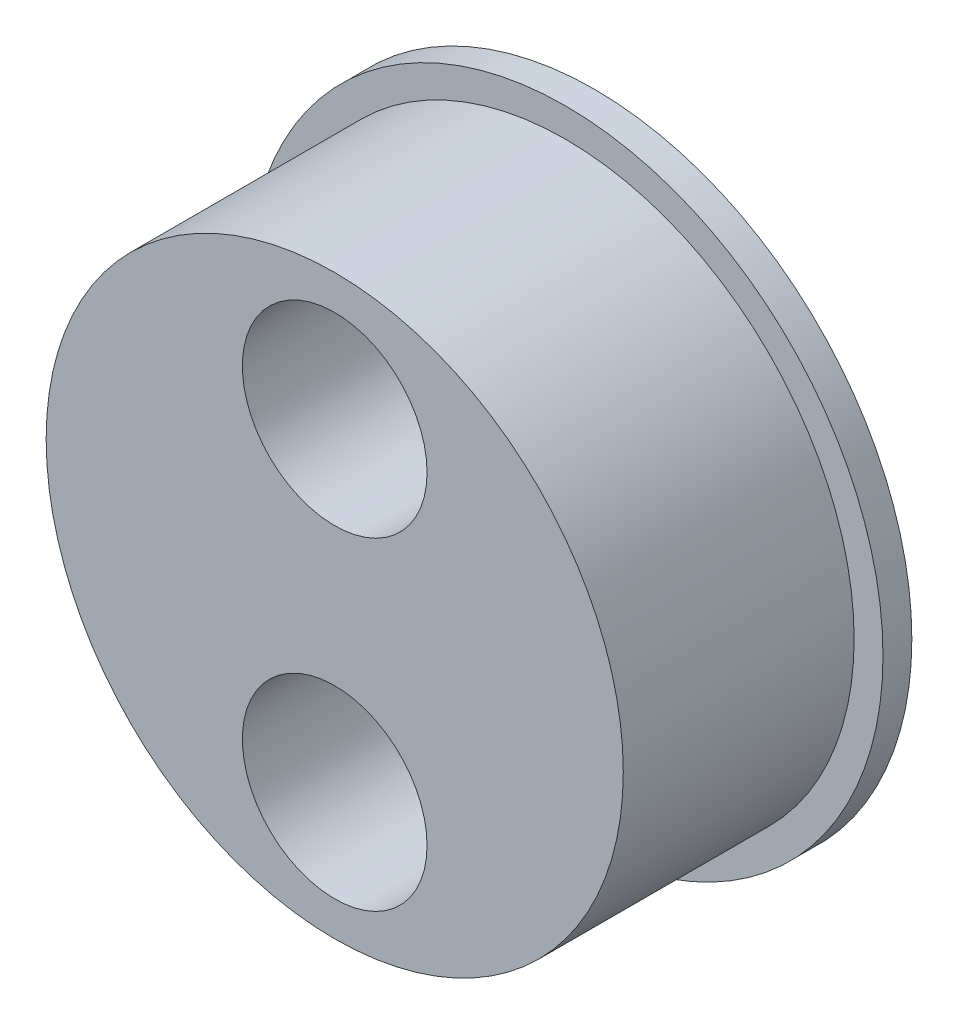
ISO-10303-21;
HEADER;
FILE_DESCRIPTION(('STEP AP214'),'2;1');
FILE_NAME('part.step','',(''),(''),'','','');
FILE_SCHEMA(('AUTOMOTIVE_DESIGN { 1 0 10303 214 1 1 1 1 }'));
ENDSEC;
DATA;
#1=APPLICATION_CONTEXT('core data for automotive mechanical design processes');
#2=APPLICATION_PROTOCOL_DEFINITION('international standard','automotive_design',2000,#1);
#3=PRODUCT_CONTEXT('',#1,'mechanical');
#4=PRODUCT('Part','Part','',(#3));
#5=PRODUCT_RELATED_PRODUCT_CATEGORY('part','',(#4));
#6=PRODUCT_DEFINITION_FORMATION('','',#4);
#7=PRODUCT_DEFINITION_CONTEXT('part definition',#1,'design');
#8=PRODUCT_DEFINITION('design','',#6,#7);
#9=PRODUCT_DEFINITION_SHAPE('','',#8);
#10=(LENGTH_UNIT() NAMED_UNIT(*) SI_UNIT(.MILLI.,.METRE.));
#11=(NAMED_UNIT(*) PLANE_ANGLE_UNIT() SI_UNIT($,.RADIAN.));
#12=(NAMED_UNIT(*) SI_UNIT($,.STERADIAN.) SOLID_ANGLE_UNIT());
#13=UNCERTAINTY_MEASURE_WITH_UNIT(LENGTH_MEASURE(1.E-05),#10,'distance_accuracy_value','');
#14=(GEOMETRIC_REPRESENTATION_CONTEXT(3) GLOBAL_UNCERTAINTY_ASSIGNED_CONTEXT((#13)) GLOBAL_UNIT_ASSIGNED_CONTEXT((#10,
#11,#12)) REPRESENTATION_CONTEXT('',''));
#15=CARTESIAN_POINT('',(0.,0.,0.));
#16=DIRECTION('',(0.,0.,1.));
#17=DIRECTION('',(1.,0.,0.));
#18=AXIS2_PLACEMENT_3D('',#15,#16,#17);
#19=CARTESIAN_POINT('',(0.,0.,19.));
#20=DIRECTION('',(0.,0.,-1.));
#21=DIRECTION('',(-1.,0.,0.));
#22=AXIS2_PLACEMENT_3D('',#19,#20,#21);
#23=CYLINDRICAL_SURFACE('',#22,5.);
#24=CARTESIAN_POINT('',(0.,0.,15.));
#25=DIRECTION('',(0.,0.,1.));
#26=DIRECTION('',(1.,0.,0.));
#27=AXIS2_PLACEMENT_3D('',#24,#25,#26);
#28=CIRCLE('',#27,5.);
#29=CARTESIAN_POINT('',(5.,0.,15.));
#30=VERTEX_POINT('',#29);
#31=EDGE_CURVE('E49',#30,#30,#28,.T.);
#32=ORIENTED_EDGE('',*,*,#31,.T.);
#33=EDGE_LOOP('',(#32));
#34=FACE_BOUND('',#33,.T.);
#35=CARTESIAN_POINT('',(0.,0.,19.));
#36=DIRECTION('',(0.,0.,1.));
#37=DIRECTION('',(1.,0.,0.));
#38=AXIS2_PLACEMENT_3D('',#35,#36,#37);
#39=CIRCLE('',#38,5.);
#40=CARTESIAN_POINT('',(5.,0.,19.));
#41=VERTEX_POINT('',#40);
#42=EDGE_CURVE('E53',#41,#41,#39,.T.);
#43=ORIENTED_EDGE('',*,*,#42,.F.);
#44=EDGE_LOOP('',(#43));
#45=FACE_BOUND('',#44,.T.);
#46=ADVANCED_FACE('F38',(#34,#45),#23,.T.);
#47=CARTESIAN_POINT('',(0.,0.,19.));
#48=DIRECTION('',(0.,0.,1.));
#49=DIRECTION('',(1.,0.,0.));
#50=AXIS2_PLACEMENT_3D('',#47,#48,#49);
#51=PLANE('',#50);
#52=CARTESIAN_POINT('',(0.,2.8,19.));
#53=DIRECTION('',(0.,0.,1.));
#54=DIRECTION('',(1.,0.,0.));
#55=AXIS2_PLACEMENT_3D('',#52,#53,#54);
#56=CIRCLE('',#55,1.6);
#57=CARTESIAN_POINT('',(1.6,2.8,19.));
#58=VERTEX_POINT('',#57);
#59=EDGE_CURVE('E62',#58,#58,#56,.T.);
#60=ORIENTED_EDGE('',*,*,#59,.F.);
#61=EDGE_LOOP('',(#60));
#62=FACE_BOUND('',#61,.T.);
#63=CARTESIAN_POINT('',(0.,-2.8,19.));
#64=DIRECTION('',(0.,0.,1.));
#65=DIRECTION('',(1.,0.,0.));
#66=AXIS2_PLACEMENT_3D('',#63,#64,#65);
#67=CIRCLE('',#66,1.6);
#68=CARTESIAN_POINT('',(1.6,-2.8,19.));
#69=VERTEX_POINT('',#68);
#70=EDGE_CURVE('E63',#69,#69,#67,.T.);
#71=ORIENTED_EDGE('',*,*,#70,.F.);
#72=EDGE_LOOP('',(#71));
#73=FACE_BOUND('',#72,.T.);
#74=ORIENTED_EDGE('',*,*,#42,.T.);
#75=EDGE_LOOP('',(#74));
#76=FACE_BOUND('',#75,.T.);
#77=ADVANCED_FACE('F72',(#62,#73,#76),#51,.T.);
#78=CARTESIAN_POINT('',(0.,2.8,-2.));
#79=DIRECTION('',(0.,0.,1.));
#80=DIRECTION('',(1.,0.,0.));
#81=AXIS2_PLACEMENT_3D('',#78,#79,#80);
#82=CYLINDRICAL_SURFACE('',#81,1.6);
#83=ORIENTED_EDGE('',*,*,#59,.T.);
#84=EDGE_LOOP('',(#83));
#85=FACE_BOUND('',#84,.T.);
#86=CARTESIAN_POINT('',(0.,2.8,14.5));
#87=DIRECTION('',(0.,0.,1.));
#88=DIRECTION('',(1.,0.,0.));
#89=AXIS2_PLACEMENT_3D('',#86,#87,#88);
#90=CIRCLE('',#89,1.6);
#91=CARTESIAN_POINT('',(1.6,2.8,14.5));
#92=VERTEX_POINT('',#91);
#93=EDGE_CURVE('E56',#92,#92,#90,.T.);
#94=ORIENTED_EDGE('',*,*,#93,.F.);
#95=EDGE_LOOP('',(#94));
#96=FACE_BOUND('',#95,.T.);
#97=ADVANCED_FACE('F69',(#85,#96),#82,.F.);
#98=CARTESIAN_POINT('',(0.,-2.8,-2.));
#99=DIRECTION('',(0.,0.,1.));
#100=DIRECTION('',(1.,0.,0.));
#101=AXIS2_PLACEMENT_3D('',#98,#99,#100);
#102=CYLINDRICAL_SURFACE('',#101,1.6);
#103=ORIENTED_EDGE('',*,*,#70,.T.);
#104=EDGE_LOOP('',(#103));
#105=FACE_BOUND('',#104,.T.);
#106=CARTESIAN_POINT('',(0.,-2.8,14.5));
#107=DIRECTION('',(0.,0.,1.));
#108=DIRECTION('',(1.,0.,0.));
#109=AXIS2_PLACEMENT_3D('',#106,#107,#108);
#110=CIRCLE('',#109,1.6);
#111=CARTESIAN_POINT('',(1.6,-2.8,14.5));
#112=VERTEX_POINT('',#111);
#113=EDGE_CURVE('E59',#112,#112,#110,.T.);
#114=ORIENTED_EDGE('',*,*,#113,.F.);
#115=EDGE_LOOP('',(#114));
#116=FACE_BOUND('',#115,.T.);
#117=ADVANCED_FACE('F98',(#105,#116),#102,.F.);
#118=CARTESIAN_POINT('',(0.,0.,15.));
#119=DIRECTION('',(0.,0.,1.));
#120=DIRECTION('',(1.,0.,0.));
#121=AXIS2_PLACEMENT_3D('',#118,#119,#120);
#122=PLANE('',#121);
#123=CARTESIAN_POINT('',(0.,0.,15.));
#124=DIRECTION('',(0.,0.,1.));
#125=DIRECTION('',(1.,0.,0.));
#126=AXIS2_PLACEMENT_3D('',#123,#124,#125);
#127=CIRCLE('',#126,5.5);
#128=CARTESIAN_POINT('',(5.5,0.,15.));
#129=VERTEX_POINT('',#128);
#130=EDGE_CURVE('E10',#129,#129,#127,.T.);
#131=ORIENTED_EDGE('',*,*,#130,.T.);
#132=EDGE_LOOP('',(#131));
#133=FACE_BOUND('',#132,.T.);
#134=ORIENTED_EDGE('',*,*,#31,.F.);
#135=EDGE_LOOP('',(#134));
#136=FACE_BOUND('',#135,.T.);
#137=ADVANCED_FACE('F93',(#133,#136),#122,.T.);
#138=CARTESIAN_POINT('',(0.,0.,15.));
#139=DIRECTION('',(0.,0.,-1.));
#140=DIRECTION('',(-1.,0.,0.));
#141=AXIS2_PLACEMENT_3D('',#138,#139,#140);
#142=CYLINDRICAL_SURFACE('',#141,5.5);
#143=ORIENTED_EDGE('',*,*,#130,.F.);
#144=EDGE_LOOP('',(#143));
#145=FACE_BOUND('',#144,.T.);
#146=CARTESIAN_POINT('',(0.,0.,14.5));
#147=DIRECTION('',(0.,0.,1.));
#148=DIRECTION('',(1.,0.,0.));
#149=AXIS2_PLACEMENT_3D('',#146,#147,#148);
#150=CIRCLE('',#149,5.5);
#151=CARTESIAN_POINT('',(5.5,0.,14.5));
#152=VERTEX_POINT('',#151);
#153=EDGE_CURVE('E42',#152,#152,#150,.T.);
#154=ORIENTED_EDGE('',*,*,#153,.T.);
#155=EDGE_LOOP('',(#154));
#156=FACE_BOUND('',#155,.T.);
#157=ADVANCED_FACE('F40',(#145,#156),#142,.T.);
#158=CARTESIAN_POINT('',(0.,0.,14.5));
#159=DIRECTION('',(0.,0.,1.));
#160=DIRECTION('',(1.,0.,0.));
#161=AXIS2_PLACEMENT_3D('',#158,#159,#160);
#162=PLANE('',#161);
#163=ORIENTED_EDGE('',*,*,#153,.F.);
#164=EDGE_LOOP('',(#163));
#165=FACE_BOUND('',#164,.T.);
#166=ORIENTED_EDGE('',*,*,#113,.T.);
#167=EDGE_LOOP('',(#166));
#168=FACE_BOUND('',#167,.T.);
#169=ORIENTED_EDGE('',*,*,#93,.T.);
#170=EDGE_LOOP('',(#169));
#171=FACE_BOUND('',#170,.T.);
#172=ADVANCED_FACE('F87',(#165,#168,#171),#162,.F.);
#173=CLOSED_SHELL('',(#46,#77,#97,#117,#137,#157,#172));
#174=MANIFOLD_SOLID_BREP('B2',#173);
#175=ADVANCED_BREP_SHAPE_REPRESENTATION('',(#18,#174),#14);
#176=SHAPE_DEFINITION_REPRESENTATION(#9,#175);
ENDSEC;
END-ISO-10303-21;
